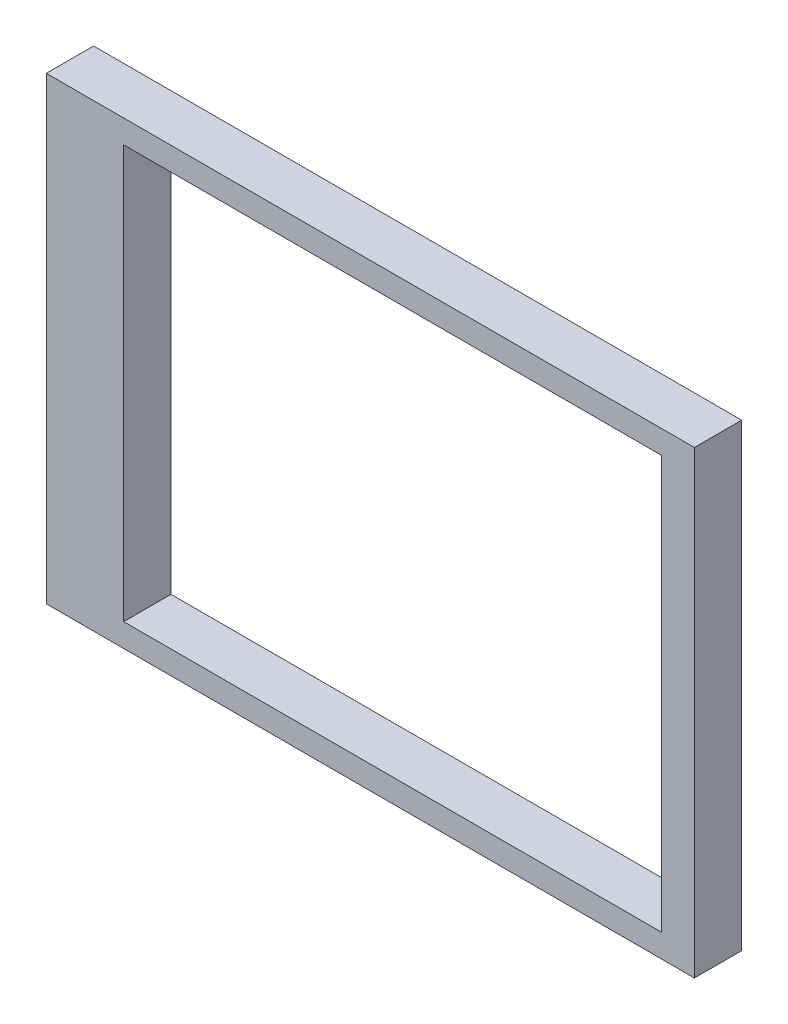
ISO-10303-21;
HEADER;
FILE_DESCRIPTION(('STEP AP214'),'2;1');
FILE_NAME('part.step','',(''),(''),'','','');
FILE_SCHEMA(('AUTOMOTIVE_DESIGN { 1 0 10303 214 1 1 1 1 }'));
ENDSEC;
DATA;
#1=APPLICATION_CONTEXT('core data for automotive mechanical design processes');
#2=APPLICATION_PROTOCOL_DEFINITION('international standard','automotive_design',2000,#1);
#3=PRODUCT_CONTEXT('',#1,'mechanical');
#4=PRODUCT('Part','Part','',(#3));
#5=PRODUCT_RELATED_PRODUCT_CATEGORY('part','',(#4));
#6=PRODUCT_DEFINITION_FORMATION('','',#4);
#7=PRODUCT_DEFINITION_CONTEXT('part definition',#1,'design');
#8=PRODUCT_DEFINITION('design','',#6,#7);
#9=PRODUCT_DEFINITION_SHAPE('','',#8);
#10=(LENGTH_UNIT() NAMED_UNIT(*) SI_UNIT(.MILLI.,.METRE.));
#11=(NAMED_UNIT(*) PLANE_ANGLE_UNIT() SI_UNIT($,.RADIAN.));
#12=(NAMED_UNIT(*) SI_UNIT($,.STERADIAN.) SOLID_ANGLE_UNIT());
#13=UNCERTAINTY_MEASURE_WITH_UNIT(LENGTH_MEASURE(1.E-05),#10,'distance_accuracy_value','');
#14=(GEOMETRIC_REPRESENTATION_CONTEXT(3) GLOBAL_UNCERTAINTY_ASSIGNED_CONTEXT((#13)) GLOBAL_UNIT_ASSIGNED_CONTEXT((#10,
#11,#12)) REPRESENTATION_CONTEXT('',''));
#15=CARTESIAN_POINT('',(0.,0.,0.));
#16=DIRECTION('',(0.,0.,1.));
#17=DIRECTION('',(1.,0.,0.));
#18=AXIS2_PLACEMENT_3D('',#15,#16,#17);
#19=CARTESIAN_POINT('',(4.40403826108748,0.614093810952889,1.6));
#20=DIRECTION('',(0.,0.,1.));
#21=DIRECTION('',(1.,0.,0.));
#22=AXIS2_PLACEMENT_3D('',#19,#20,#21);
#23=PLANE('',#22);
#24=DIRECTION('',(0.,-1.,0.));
#25=VECTOR('',#24,1.);
#26=CARTESIAN_POINT('',(31.4640382610875,19.8140938109529,1.6));
#27=LINE('',#26,#25);
#28=CARTESIAN_POINT('',(31.4640382610875,19.8140938109529,1.6));
#29=VERTEX_POINT('',#28);
#30=CARTESIAN_POINT('',(31.4640382610875,-18.5859061890471,1.6));
#31=VERTEX_POINT('',#30);
#32=EDGE_CURVE('E179',#29,#31,#27,.T.);
#33=ORIENTED_EDGE('',*,*,#32,.F.);
#34=DIRECTION('',(1.,0.,0.));
#35=VECTOR('',#34,1.);
#36=CARTESIAN_POINT('',(-18.5359617389125,19.8140938109529,1.6));
#37=LINE('',#36,#35);
#38=CARTESIAN_POINT('',(-18.5359617389125,19.8140938109529,1.6));
#39=VERTEX_POINT('',#38);
#40=EDGE_CURVE('E162',#39,#29,#37,.T.);
#41=ORIENTED_EDGE('',*,*,#40,.F.);
#42=DIRECTION('',(0.,1.,0.));
#43=VECTOR('',#42,1.);
#44=CARTESIAN_POINT('',(-18.5359617389125,-18.5859061890471,1.6));
#45=LINE('',#44,#43);
#46=CARTESIAN_POINT('',(-18.5359617389125,-18.5859061890471,1.6));
#47=VERTEX_POINT('',#46);
#48=EDGE_CURVE('E151',#47,#39,#45,.T.);
#49=ORIENTED_EDGE('',*,*,#48,.F.);
#50=DIRECTION('',(-1.,0.,0.));
#51=VECTOR('',#50,1.);
#52=CARTESIAN_POINT('',(31.4640382610875,-18.5859061890471,1.6));
#53=LINE('',#52,#51);
#54=EDGE_CURVE('E161',#31,#47,#53,.T.);
#55=ORIENTED_EDGE('',*,*,#54,.F.);
#56=EDGE_LOOP('',(#33,#41,#49,#55));
#57=FACE_BOUND('',#56,.T.);
#58=DIRECTION('',(1.,0.,0.));
#59=VECTOR('',#58,1.);
#60=CARTESIAN_POINT('',(-36.1359617389125,21.9740938109529,1.6));
#61=LINE('',#60,#59);
#62=CARTESIAN_POINT('',(-25.7259617389125,21.9740938109529,1.6));
#63=VERTEX_POINT('',#62);
#64=CARTESIAN_POINT('',(34.5340382610875,21.9740938109529,1.6));
#65=VERTEX_POINT('',#64);
#66=EDGE_CURVE('E26',#63,#65,#61,.T.);
#67=ORIENTED_EDGE('',*,*,#66,.T.);
#68=DIRECTION('',(0.,-1.,0.));
#69=VECTOR('',#68,1.);
#70=CARTESIAN_POINT('',(34.5340382610875,21.9740938109529,1.6));
#71=LINE('',#70,#69);
#72=CARTESIAN_POINT('',(34.5340382610875,-20.7459061890471,1.6));
#73=VERTEX_POINT('',#72);
#74=EDGE_CURVE('E119',#65,#73,#71,.T.);
#75=ORIENTED_EDGE('',*,*,#74,.T.);
#76=DIRECTION('',(-1.,0.,0.));
#77=VECTOR('',#76,1.);
#78=CARTESIAN_POINT('',(41.0440382610875,-20.7459061890471,1.6));
#79=LINE('',#78,#77);
#80=CARTESIAN_POINT('',(-25.7259617389125,-20.7459061890471,1.6));
#81=VERTEX_POINT('',#80);
#82=EDGE_CURVE('E112',#73,#81,#79,.T.);
#83=ORIENTED_EDGE('',*,*,#82,.T.);
#84=DIRECTION('',(0.,1.,0.));
#85=VECTOR('',#84,1.);
#86=CARTESIAN_POINT('',(-25.7259617389125,-20.7459061890471,1.6));
#87=LINE('',#86,#85);
#88=EDGE_CURVE('E97',#81,#63,#87,.T.);
#89=ORIENTED_EDGE('',*,*,#88,.T.);
#90=EDGE_LOOP('',(#67,#75,#83,#89));
#91=FACE_BOUND('',#90,.T.);
#92=ADVANCED_FACE('F16',(#57,#91),#23,.F.);
#93=CARTESIAN_POINT('',(4.40403826108748,0.614093810952889,6.));
#94=DIRECTION('',(0.,0.,1.));
#95=DIRECTION('',(1.,0.,0.));
#96=AXIS2_PLACEMENT_3D('',#93,#94,#95);
#97=PLANE('',#96);
#98=DIRECTION('',(0.,-1.,0.));
#99=VECTOR('',#98,1.);
#100=CARTESIAN_POINT('',(31.4640382610875,19.8140938109529,6.));
#101=LINE('',#100,#99);
#102=CARTESIAN_POINT('',(31.4640382610875,19.8140938109529,6.));
#103=VERTEX_POINT('',#102);
#104=CARTESIAN_POINT('',(31.4640382610875,-18.5859061890471,6.));
#105=VERTEX_POINT('',#104);
#106=EDGE_CURVE('E132',#103,#105,#101,.T.);
#107=ORIENTED_EDGE('',*,*,#106,.T.);
#108=DIRECTION('',(-1.,0.,0.));
#109=VECTOR('',#108,1.);
#110=CARTESIAN_POINT('',(31.4640382610875,-18.5859061890471,6.));
#111=LINE('',#110,#109);
#112=CARTESIAN_POINT('',(-18.5359617389125,-18.5859061890471,6.));
#113=VERTEX_POINT('',#112);
#114=EDGE_CURVE('E158',#105,#113,#111,.T.);
#115=ORIENTED_EDGE('',*,*,#114,.T.);
#116=DIRECTION('',(0.,1.,0.));
#117=VECTOR('',#116,1.);
#118=CARTESIAN_POINT('',(-18.5359617389125,-18.5859061890471,6.));
#119=LINE('',#118,#117);
#120=CARTESIAN_POINT('',(-18.5359617389125,19.8140938109529,6.));
#121=VERTEX_POINT('',#120);
#122=EDGE_CURVE('E154',#113,#121,#119,.T.);
#123=ORIENTED_EDGE('',*,*,#122,.T.);
#124=DIRECTION('',(1.,0.,0.));
#125=VECTOR('',#124,1.);
#126=CARTESIAN_POINT('',(-18.5359617389125,19.8140938109529,6.));
#127=LINE('',#126,#125);
#128=EDGE_CURVE('E152',#121,#103,#127,.T.);
#129=ORIENTED_EDGE('',*,*,#128,.T.);
#130=EDGE_LOOP('',(#107,#115,#123,#129));
#131=FACE_BOUND('',#130,.T.);
#132=DIRECTION('',(-1.,0.,0.));
#133=VECTOR('',#132,1.);
#134=CARTESIAN_POINT('',(-36.1359617389125,21.9740938109529,6.));
#135=LINE('',#134,#133);
#136=CARTESIAN_POINT('',(34.5340382610875,21.9740938109529,6.));
#137=VERTEX_POINT('',#136);
#138=CARTESIAN_POINT('',(-25.7259617389125,21.9740938109529,6.));
#139=VERTEX_POINT('',#138);
#140=EDGE_CURVE('E11',#137,#139,#135,.T.);
#141=ORIENTED_EDGE('',*,*,#140,.T.);
#142=DIRECTION('',(0.,-1.,0.));
#143=VECTOR('',#142,1.);
#144=CARTESIAN_POINT('',(-25.7259617389125,-20.7459061890471,6.));
#145=LINE('',#144,#143);
#146=CARTESIAN_POINT('',(-25.7259617389125,-20.7459061890471,6.));
#147=VERTEX_POINT('',#146);
#148=EDGE_CURVE('E107',#139,#147,#145,.T.);
#149=ORIENTED_EDGE('',*,*,#148,.T.);
#150=DIRECTION('',(1.,0.,0.));
#151=VECTOR('',#150,1.);
#152=CARTESIAN_POINT('',(41.0440382610875,-20.7459061890471,6.));
#153=LINE('',#152,#151);
#154=CARTESIAN_POINT('',(34.5340382610875,-20.7459061890471,6.));
#155=VERTEX_POINT('',#154);
#156=EDGE_CURVE('E114',#147,#155,#153,.T.);
#157=ORIENTED_EDGE('',*,*,#156,.T.);
#158=DIRECTION('',(0.,1.,0.));
#159=VECTOR('',#158,1.);
#160=CARTESIAN_POINT('',(34.5340382610875,21.9740938109529,6.));
#161=LINE('',#160,#159);
#162=EDGE_CURVE('E129',#155,#137,#161,.T.);
#163=ORIENTED_EDGE('',*,*,#162,.T.);
#164=EDGE_LOOP('',(#141,#149,#157,#163));
#165=FACE_BOUND('',#164,.T.);
#166=ADVANCED_FACE('F193',(#131,#165),#97,.T.);
#167=CARTESIAN_POINT('',(34.5340382610875,21.9740938109529,1.6));
#168=DIRECTION('',(0.,1.,0.));
#169=DIRECTION('',(1.,0.,0.));
#170=AXIS2_PLACEMENT_3D('',#167,#168,#169);
#171=PLANE('',#170);
#172=ORIENTED_EDGE('',*,*,#66,.F.);
#173=DIRECTION('',(0.,0.,1.));
#174=VECTOR('',#173,1.);
#175=CARTESIAN_POINT('',(-25.7259617389125,21.9740938109529,1.6));
#176=LINE('',#175,#174);
#177=EDGE_CURVE('E103',#63,#139,#176,.T.);
#178=ORIENTED_EDGE('',*,*,#177,.T.);
#179=ORIENTED_EDGE('',*,*,#140,.F.);
#180=DIRECTION('',(0.,0.,1.));
#181=VECTOR('',#180,1.);
#182=CARTESIAN_POINT('',(34.5340382610875,21.9740938109529,1.6));
#183=LINE('',#182,#181);
#184=EDGE_CURVE('E175',#65,#137,#183,.T.);
#185=ORIENTED_EDGE('',*,*,#184,.F.);
#186=EDGE_LOOP('',(#172,#178,#179,#185));
#187=FACE_BOUND('',#186,.T.);
#188=ADVANCED_FACE('F290',(#187),#171,.T.);
#189=CARTESIAN_POINT('',(-25.7259617389125,21.9740938109529,1.6));
#190=DIRECTION('',(-1.,0.,0.));
#191=DIRECTION('',(0.,0.,1.));
#192=AXIS2_PLACEMENT_3D('',#189,#190,#191);
#193=PLANE('',#192);
#194=ORIENTED_EDGE('',*,*,#88,.F.);
#195=DIRECTION('',(0.,0.,1.));
#196=VECTOR('',#195,1.);
#197=CARTESIAN_POINT('',(-25.7259617389125,-20.7459061890471,1.6));
#198=LINE('',#197,#196);
#199=EDGE_CURVE('E101',#81,#147,#198,.T.);
#200=ORIENTED_EDGE('',*,*,#199,.T.);
#201=ORIENTED_EDGE('',*,*,#148,.F.);
#202=ORIENTED_EDGE('',*,*,#177,.F.);
#203=EDGE_LOOP('',(#194,#200,#201,#202));
#204=FACE_BOUND('',#203,.T.);
#205=ADVANCED_FACE('F99',(#204),#193,.T.);
#206=CARTESIAN_POINT('',(-25.7259617389125,-20.7459061890471,1.6));
#207=DIRECTION('',(0.,-1.,0.));
#208=DIRECTION('',(0.,0.,-1.));
#209=AXIS2_PLACEMENT_3D('',#206,#207,#208);
#210=PLANE('',#209);
#211=ORIENTED_EDGE('',*,*,#82,.F.);
#212=DIRECTION('',(0.,0.,1.));
#213=VECTOR('',#212,1.);
#214=CARTESIAN_POINT('',(34.5340382610875,-20.7459061890471,1.6));
#215=LINE('',#214,#213);
#216=EDGE_CURVE('E121',#73,#155,#215,.T.);
#217=ORIENTED_EDGE('',*,*,#216,.T.);
#218=ORIENTED_EDGE('',*,*,#156,.F.);
#219=ORIENTED_EDGE('',*,*,#199,.F.);
#220=EDGE_LOOP('',(#211,#217,#218,#219));
#221=FACE_BOUND('',#220,.T.);
#222=ADVANCED_FACE('F110',(#221),#210,.T.);
#223=CARTESIAN_POINT('',(34.5340382610875,-20.7459061890471,1.6));
#224=DIRECTION('',(1.,0.,0.));
#225=DIRECTION('',(0.,1.,0.));
#226=AXIS2_PLACEMENT_3D('',#223,#224,#225);
#227=PLANE('',#226);
#228=ORIENTED_EDGE('',*,*,#74,.F.);
#229=ORIENTED_EDGE('',*,*,#184,.T.);
#230=ORIENTED_EDGE('',*,*,#162,.F.);
#231=ORIENTED_EDGE('',*,*,#216,.F.);
#232=EDGE_LOOP('',(#228,#229,#230,#231));
#233=FACE_BOUND('',#232,.T.);
#234=ADVANCED_FACE('F307',(#233),#227,.T.);
#235=CARTESIAN_POINT('',(31.4640382610875,19.8140938109529,1.6));
#236=DIRECTION('',(-1.,0.,0.));
#237=DIRECTION('',(0.,0.,1.));
#238=AXIS2_PLACEMENT_3D('',#235,#236,#237);
#239=PLANE('',#238);
#240=ORIENTED_EDGE('',*,*,#32,.T.);
#241=DIRECTION('',(0.,0.,1.));
#242=VECTOR('',#241,1.);
#243=CARTESIAN_POINT('',(31.4640382610875,-18.5859061890471,1.6));
#244=LINE('',#243,#242);
#245=EDGE_CURVE('E146',#31,#105,#244,.T.);
#246=ORIENTED_EDGE('',*,*,#245,.T.);
#247=ORIENTED_EDGE('',*,*,#106,.F.);
#248=DIRECTION('',(0.,0.,1.));
#249=VECTOR('',#248,1.);
#250=CARTESIAN_POINT('',(31.4640382610875,19.8140938109529,1.6));
#251=LINE('',#250,#249);
#252=EDGE_CURVE('E165',#29,#103,#251,.T.);
#253=ORIENTED_EDGE('',*,*,#252,.F.);
#254=EDGE_LOOP('',(#240,#246,#247,#253));
#255=FACE_BOUND('',#254,.T.);
#256=ADVANCED_FACE('F202',(#255),#239,.T.);
#257=CARTESIAN_POINT('',(31.4640382610875,-18.5859061890471,1.6));
#258=DIRECTION('',(0.,1.,0.));
#259=DIRECTION('',(1.,0.,0.));
#260=AXIS2_PLACEMENT_3D('',#257,#258,#259);
#261=PLANE('',#260);
#262=ORIENTED_EDGE('',*,*,#54,.T.);
#263=DIRECTION('',(0.,0.,1.));
#264=VECTOR('',#263,1.);
#265=CARTESIAN_POINT('',(-18.5359617389125,-18.5859061890471,1.6));
#266=LINE('',#265,#264);
#267=EDGE_CURVE('E157',#47,#113,#266,.T.);
#268=ORIENTED_EDGE('',*,*,#267,.T.);
#269=ORIENTED_EDGE('',*,*,#114,.F.);
#270=ORIENTED_EDGE('',*,*,#245,.F.);
#271=EDGE_LOOP('',(#262,#268,#269,#270));
#272=FACE_BOUND('',#271,.T.);
#273=ADVANCED_FACE('F18',(#272),#261,.T.);
#274=CARTESIAN_POINT('',(-18.5359617389125,-18.5859061890471,1.6));
#275=DIRECTION('',(1.,0.,0.));
#276=DIRECTION('',(0.,1.,0.));
#277=AXIS2_PLACEMENT_3D('',#274,#275,#276);
#278=PLANE('',#277);
#279=ORIENTED_EDGE('',*,*,#48,.T.);
#280=DIRECTION('',(0.,0.,1.));
#281=VECTOR('',#280,1.);
#282=CARTESIAN_POINT('',(-18.5359617389125,19.8140938109529,1.6));
#283=LINE('',#282,#281);
#284=EDGE_CURVE('E148',#39,#121,#283,.T.);
#285=ORIENTED_EDGE('',*,*,#284,.T.);
#286=ORIENTED_EDGE('',*,*,#122,.F.);
#287=ORIENTED_EDGE('',*,*,#267,.F.);
#288=EDGE_LOOP('',(#279,#285,#286,#287));
#289=FACE_BOUND('',#288,.T.);
#290=ADVANCED_FACE('F276',(#289),#278,.T.);
#291=CARTESIAN_POINT('',(-18.5359617389125,19.8140938109529,1.6));
#292=DIRECTION('',(0.,-1.,0.));
#293=DIRECTION('',(0.,0.,-1.));
#294=AXIS2_PLACEMENT_3D('',#291,#292,#293);
#295=PLANE('',#294);
#296=ORIENTED_EDGE('',*,*,#40,.T.);
#297=ORIENTED_EDGE('',*,*,#252,.T.);
#298=ORIENTED_EDGE('',*,*,#128,.F.);
#299=ORIENTED_EDGE('',*,*,#284,.F.);
#300=EDGE_LOOP('',(#296,#297,#298,#299));
#301=FACE_BOUND('',#300,.T.);
#302=ADVANCED_FACE('F199',(#301),#295,.T.);
#303=CLOSED_SHELL('',(#92,#166,#188,#205,#222,#234,#256,#273,#290,#302));
#304=MANIFOLD_SOLID_BREP('B1',#303);
#305=ADVANCED_BREP_SHAPE_REPRESENTATION('',(#18,#304),#14);
#306=SHAPE_DEFINITION_REPRESENTATION(#9,#305);
ENDSEC;
END-ISO-10303-21;
